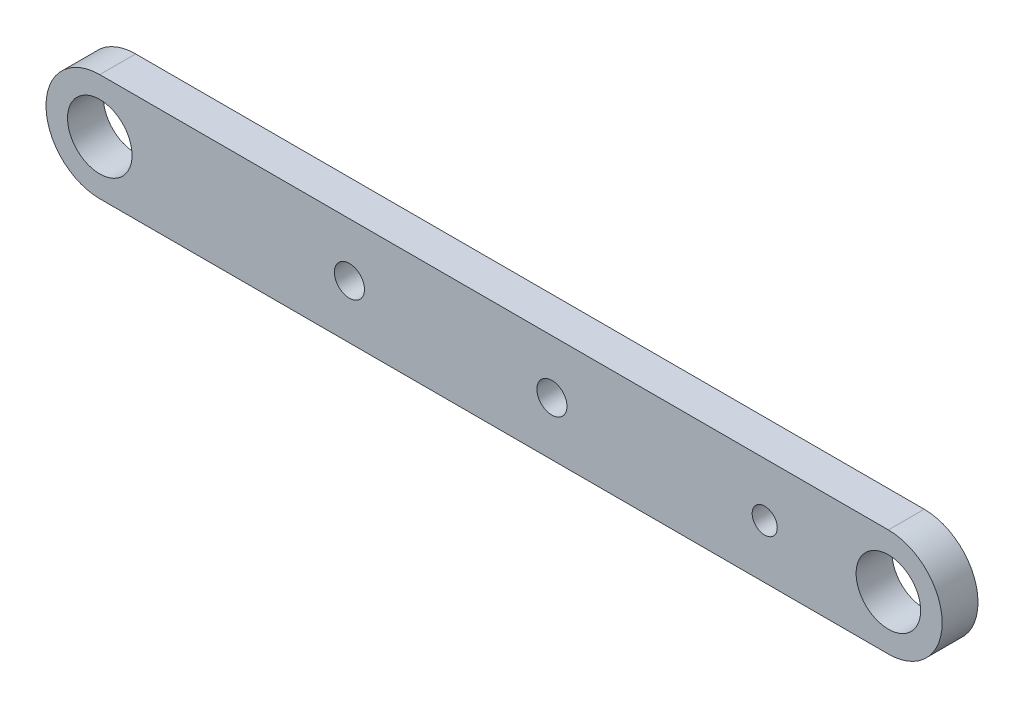
ISO-10303-21;
HEADER;
FILE_DESCRIPTION(('STEP AP214'),'2;1');
FILE_NAME('part.step','',(''),(''),'','','');
FILE_SCHEMA(('AUTOMOTIVE_DESIGN { 1 0 10303 214 1 1 1 1 }'));
ENDSEC;
DATA;
#1=APPLICATION_CONTEXT('core data for automotive mechanical design processes');
#2=APPLICATION_PROTOCOL_DEFINITION('international standard','automotive_design',2000,#1);
#3=PRODUCT_CONTEXT('',#1,'mechanical');
#4=PRODUCT('Part','Part','',(#3));
#5=PRODUCT_RELATED_PRODUCT_CATEGORY('part','',(#4));
#6=PRODUCT_DEFINITION_FORMATION('','',#4);
#7=PRODUCT_DEFINITION_CONTEXT('part definition',#1,'design');
#8=PRODUCT_DEFINITION('design','',#6,#7);
#9=PRODUCT_DEFINITION_SHAPE('','',#8);
#10=(LENGTH_UNIT() NAMED_UNIT(*) SI_UNIT(.MILLI.,.METRE.));
#11=(NAMED_UNIT(*) PLANE_ANGLE_UNIT() SI_UNIT($,.RADIAN.));
#12=(NAMED_UNIT(*) SI_UNIT($,.STERADIAN.) SOLID_ANGLE_UNIT());
#13=UNCERTAINTY_MEASURE_WITH_UNIT(LENGTH_MEASURE(1.E-05),#10,'distance_accuracy_value','');
#14=(GEOMETRIC_REPRESENTATION_CONTEXT(3) GLOBAL_UNCERTAINTY_ASSIGNED_CONTEXT((#13)) GLOBAL_UNIT_ASSIGNED_CONTEXT((#10,
#11,#12)) REPRESENTATION_CONTEXT('',''));
#15=CARTESIAN_POINT('',(0.,0.,0.));
#16=DIRECTION('',(0.,0.,1.));
#17=DIRECTION('',(1.,0.,0.));
#18=AXIS2_PLACEMENT_3D('',#15,#16,#17);
#19=CARTESIAN_POINT('',(-110.,0.,5.));
#20=DIRECTION('',(0.,0.,1.));
#21=DIRECTION('',(1.,0.,0.));
#22=AXIS2_PLACEMENT_3D('',#19,#20,#21);
#23=PLANE('',#22);
#24=CARTESIAN_POINT('',(-46.93,0.,5.));
#25=DIRECTION('',(0.,0.,1.));
#26=DIRECTION('',(1.,0.,0.));
#27=AXIS2_PLACEMENT_3D('',#24,#25,#26);
#28=CIRCLE('',#27,2.1);
#29=CARTESIAN_POINT('',(-44.83,0.,5.));
#30=VERTEX_POINT('',#29);
#31=EDGE_CURVE('E128',#30,#30,#28,.T.);
#32=ORIENTED_EDGE('',*,*,#31,.F.);
#33=EDGE_LOOP('',(#32));
#34=FACE_BOUND('',#33,.T.);
#35=CARTESIAN_POINT('',(-110.,0.,5.));
#36=DIRECTION('',(0.,0.,1.));
#37=DIRECTION('',(1.,0.,0.));
#38=AXIS2_PLACEMENT_3D('',#35,#36,#37);
#39=CIRCLE('',#38,4.5);
#40=CARTESIAN_POINT('',(-105.5,0.,5.));
#41=VERTEX_POINT('',#40);
#42=EDGE_CURVE('E116',#41,#41,#39,.T.);
#43=ORIENTED_EDGE('',*,*,#42,.F.);
#44=EDGE_LOOP('',(#43));
#45=FACE_BOUND('',#44,.T.);
#46=CARTESIAN_POINT('',(-110.,0.,5.));
#47=DIRECTION('',(0.,0.,1.));
#48=DIRECTION('',(1.,0.,0.));
#49=AXIS2_PLACEMENT_3D('',#46,#47,#48);
#50=CIRCLE('',#49,7.5);
#51=CARTESIAN_POINT('',(-110.,7.5,5.));
#52=VERTEX_POINT('',#51);
#53=CARTESIAN_POINT('',(-110.,-7.5,5.));
#54=VERTEX_POINT('',#53);
#55=EDGE_CURVE('E86',#52,#54,#50,.T.);
#56=ORIENTED_EDGE('',*,*,#55,.T.);
#57=DIRECTION('',(1.,0.,0.));
#58=VECTOR('',#57,1.);
#59=CARTESIAN_POINT('',(-110.,-7.5,5.));
#60=LINE('',#59,#58);
#61=CARTESIAN_POINT('',(0.,-7.5,5.));
#62=VERTEX_POINT('',#61);
#63=EDGE_CURVE('E81',#54,#62,#60,.T.);
#64=ORIENTED_EDGE('',*,*,#63,.T.);
#65=CARTESIAN_POINT('',(0.,0.,5.));
#66=DIRECTION('',(0.,0.,1.));
#67=DIRECTION('',(1.,0.,0.));
#68=AXIS2_PLACEMENT_3D('',#65,#66,#67);
#69=CIRCLE('',#68,7.5);
#70=CARTESIAN_POINT('',(0.,7.5,5.));
#71=VERTEX_POINT('',#70);
#72=EDGE_CURVE('E84',#62,#71,#69,.T.);
#73=ORIENTED_EDGE('',*,*,#72,.T.);
#74=DIRECTION('',(-1.,0.,0.));
#75=VECTOR('',#74,1.);
#76=CARTESIAN_POINT('',(-110.,7.5,5.));
#77=LINE('',#76,#75);
#78=EDGE_CURVE('E51',#71,#52,#77,.T.);
#79=ORIENTED_EDGE('',*,*,#78,.T.);
#80=EDGE_LOOP('',(#56,#64,#73,#79));
#81=FACE_BOUND('',#80,.T.);
#82=CARTESIAN_POINT('',(0.,0.,5.));
#83=DIRECTION('',(0.,0.,1.));
#84=DIRECTION('',(1.,0.,0.));
#85=AXIS2_PLACEMENT_3D('',#82,#83,#84);
#86=CIRCLE('',#85,4.5);
#87=CARTESIAN_POINT('',(4.5,0.,5.));
#88=VERTEX_POINT('',#87);
#89=EDGE_CURVE('E101',#88,#88,#86,.T.);
#90=ORIENTED_EDGE('',*,*,#89,.F.);
#91=EDGE_LOOP('',(#90));
#92=FACE_BOUND('',#91,.T.);
#93=CARTESIAN_POINT('',(-75.18,0.,5.));
#94=DIRECTION('',(0.,0.,1.));
#95=DIRECTION('',(1.,0.,0.));
#96=AXIS2_PLACEMENT_3D('',#93,#94,#95);
#97=CIRCLE('',#96,2.1);
#98=CARTESIAN_POINT('',(-73.08,0.,5.));
#99=VERTEX_POINT('',#98);
#100=EDGE_CURVE('E122',#99,#99,#97,.T.);
#101=ORIENTED_EDGE('',*,*,#100,.F.);
#102=EDGE_LOOP('',(#101));
#103=FACE_BOUND('',#102,.T.);
#104=CARTESIAN_POINT('',(-17.25,0.,5.));
#105=DIRECTION('',(0.,0.,1.));
#106=DIRECTION('',(1.,0.,0.));
#107=AXIS2_PLACEMENT_3D('',#104,#105,#106);
#108=CIRCLE('',#107,1.75);
#109=CARTESIAN_POINT('',(-15.5,0.,5.));
#110=VERTEX_POINT('',#109);
#111=EDGE_CURVE('E134',#110,#110,#108,.T.);
#112=ORIENTED_EDGE('',*,*,#111,.F.);
#113=EDGE_LOOP('',(#112));
#114=FACE_BOUND('',#113,.T.);
#115=ADVANCED_FACE('F34',(#34,#45,#81,#92,#103,#114),#23,.T.);
#116=CARTESIAN_POINT('',(-110.,0.,0.));
#117=DIRECTION('',(0.,0.,1.));
#118=DIRECTION('',(1.,0.,0.));
#119=AXIS2_PLACEMENT_3D('',#116,#117,#118);
#120=PLANE('',#119);
#121=CARTESIAN_POINT('',(-110.,0.,0.));
#122=DIRECTION('',(0.,0.,1.));
#123=DIRECTION('',(1.,0.,0.));
#124=AXIS2_PLACEMENT_3D('',#121,#122,#123);
#125=CIRCLE('',#124,7.5);
#126=CARTESIAN_POINT('',(-110.,7.5,0.));
#127=VERTEX_POINT('',#126);
#128=CARTESIAN_POINT('',(-110.,-7.5,0.));
#129=VERTEX_POINT('',#128);
#130=EDGE_CURVE('E98',#127,#129,#125,.T.);
#131=ORIENTED_EDGE('',*,*,#130,.F.);
#132=DIRECTION('',(-1.,0.,0.));
#133=VECTOR('',#132,1.);
#134=CARTESIAN_POINT('',(-110.,7.5,0.));
#135=LINE('',#134,#133);
#136=CARTESIAN_POINT('',(0.,7.5,0.));
#137=VERTEX_POINT('',#136);
#138=EDGE_CURVE('E74',#137,#127,#135,.T.);
#139=ORIENTED_EDGE('',*,*,#138,.F.);
#140=CARTESIAN_POINT('',(0.,0.,0.));
#141=DIRECTION('',(0.,0.,1.));
#142=DIRECTION('',(1.,0.,0.));
#143=AXIS2_PLACEMENT_3D('',#140,#141,#142);
#144=CIRCLE('',#143,7.5);
#145=CARTESIAN_POINT('',(0.,-7.5,0.));
#146=VERTEX_POINT('',#145);
#147=EDGE_CURVE('E68',#146,#137,#144,.T.);
#148=ORIENTED_EDGE('',*,*,#147,.F.);
#149=DIRECTION('',(1.,0.,0.));
#150=VECTOR('',#149,1.);
#151=CARTESIAN_POINT('',(-110.,-7.5,0.));
#152=LINE('',#151,#150);
#153=EDGE_CURVE('E90',#129,#146,#152,.T.);
#154=ORIENTED_EDGE('',*,*,#153,.F.);
#155=EDGE_LOOP('',(#131,#139,#148,#154));
#156=FACE_BOUND('',#155,.T.);
#157=CARTESIAN_POINT('',(0.,0.,0.));
#158=DIRECTION('',(0.,0.,1.));
#159=DIRECTION('',(1.,0.,0.));
#160=AXIS2_PLACEMENT_3D('',#157,#158,#159);
#161=CIRCLE('',#160,4.5);
#162=CARTESIAN_POINT('',(4.5,0.,0.));
#163=VERTEX_POINT('',#162);
#164=EDGE_CURVE('E113',#163,#163,#161,.T.);
#165=ORIENTED_EDGE('',*,*,#164,.T.);
#166=EDGE_LOOP('',(#165));
#167=FACE_BOUND('',#166,.T.);
#168=CARTESIAN_POINT('',(-110.,0.,0.));
#169=DIRECTION('',(0.,0.,1.));
#170=DIRECTION('',(1.,0.,0.));
#171=AXIS2_PLACEMENT_3D('',#168,#169,#170);
#172=CIRCLE('',#171,4.5);
#173=CARTESIAN_POINT('',(-105.5,0.,0.));
#174=VERTEX_POINT('',#173);
#175=EDGE_CURVE('E119',#174,#174,#172,.T.);
#176=ORIENTED_EDGE('',*,*,#175,.T.);
#177=EDGE_LOOP('',(#176));
#178=FACE_BOUND('',#177,.T.);
#179=CARTESIAN_POINT('',(-75.18,0.,0.));
#180=DIRECTION('',(0.,0.,1.));
#181=DIRECTION('',(1.,0.,0.));
#182=AXIS2_PLACEMENT_3D('',#179,#180,#181);
#183=CIRCLE('',#182,2.1);
#184=CARTESIAN_POINT('',(-73.08,0.,0.));
#185=VERTEX_POINT('',#184);
#186=EDGE_CURVE('E125',#185,#185,#183,.T.);
#187=ORIENTED_EDGE('',*,*,#186,.T.);
#188=EDGE_LOOP('',(#187));
#189=FACE_BOUND('',#188,.T.);
#190=CARTESIAN_POINT('',(-46.93,0.,0.));
#191=DIRECTION('',(0.,0.,1.));
#192=DIRECTION('',(1.,0.,0.));
#193=AXIS2_PLACEMENT_3D('',#190,#191,#192);
#194=CIRCLE('',#193,2.1);
#195=CARTESIAN_POINT('',(-44.83,0.,0.));
#196=VERTEX_POINT('',#195);
#197=EDGE_CURVE('E131',#196,#196,#194,.T.);
#198=ORIENTED_EDGE('',*,*,#197,.T.);
#199=EDGE_LOOP('',(#198));
#200=FACE_BOUND('',#199,.T.);
#201=CARTESIAN_POINT('',(-17.25,0.,0.));
#202=DIRECTION('',(0.,0.,1.));
#203=DIRECTION('',(1.,0.,0.));
#204=AXIS2_PLACEMENT_3D('',#201,#202,#203);
#205=CIRCLE('',#204,1.75);
#206=CARTESIAN_POINT('',(-15.5,0.,0.));
#207=VERTEX_POINT('',#206);
#208=EDGE_CURVE('E137',#207,#207,#205,.T.);
#209=ORIENTED_EDGE('',*,*,#208,.T.);
#210=EDGE_LOOP('',(#209));
#211=FACE_BOUND('',#210,.T.);
#212=ADVANCED_FACE('F109',(#156,#167,#178,#189,#200,#211),#120,.F.);
#213=CARTESIAN_POINT('',(-110.,0.,5.));
#214=DIRECTION('',(0.,0.,-1.));
#215=DIRECTION('',(-1.,0.,0.));
#216=AXIS2_PLACEMENT_3D('',#213,#214,#215);
#217=CYLINDRICAL_SURFACE('',#216,7.5);
#218=ORIENTED_EDGE('',*,*,#130,.T.);
#219=DIRECTION('',(0.,0.,-1.));
#220=VECTOR('',#219,1.);
#221=CARTESIAN_POINT('',(-110.,-7.5,5.));
#222=LINE('',#221,#220);
#223=EDGE_CURVE('E11',#54,#129,#222,.T.);
#224=ORIENTED_EDGE('',*,*,#223,.F.);
#225=ORIENTED_EDGE('',*,*,#55,.F.);
#226=DIRECTION('',(0.,0.,-1.));
#227=VECTOR('',#226,1.);
#228=CARTESIAN_POINT('',(-110.,7.5,5.));
#229=LINE('',#228,#227);
#230=EDGE_CURVE('E94',#52,#127,#229,.T.);
#231=ORIENTED_EDGE('',*,*,#230,.T.);
#232=EDGE_LOOP('',(#218,#224,#225,#231));
#233=FACE_BOUND('',#232,.T.);
#234=ADVANCED_FACE('F36',(#233),#217,.T.);
#235=CARTESIAN_POINT('',(-110.,-7.5,5.));
#236=DIRECTION('',(0.,1.,0.));
#237=DIRECTION('',(0.,0.,1.));
#238=AXIS2_PLACEMENT_3D('',#235,#236,#237);
#239=PLANE('',#238);
#240=ORIENTED_EDGE('',*,*,#153,.T.);
#241=DIRECTION('',(0.,0.,-1.));
#242=VECTOR('',#241,1.);
#243=CARTESIAN_POINT('',(0.,-7.5,5.));
#244=LINE('',#243,#242);
#245=EDGE_CURVE('E43',#62,#146,#244,.T.);
#246=ORIENTED_EDGE('',*,*,#245,.F.);
#247=ORIENTED_EDGE('',*,*,#63,.F.);
#248=ORIENTED_EDGE('',*,*,#223,.T.);
#249=EDGE_LOOP('',(#240,#246,#247,#248));
#250=FACE_BOUND('',#249,.T.);
#251=ADVANCED_FACE('F89',(#250),#239,.F.);
#252=CARTESIAN_POINT('',(0.,0.,5.));
#253=DIRECTION('',(0.,0.,-1.));
#254=DIRECTION('',(-1.,0.,0.));
#255=AXIS2_PLACEMENT_3D('',#252,#253,#254);
#256=CYLINDRICAL_SURFACE('',#255,7.5);
#257=ORIENTED_EDGE('',*,*,#147,.T.);
#258=DIRECTION('',(0.,0.,-1.));
#259=VECTOR('',#258,1.);
#260=CARTESIAN_POINT('',(0.,7.5,5.));
#261=LINE('',#260,#259);
#262=EDGE_CURVE('E91',#71,#137,#261,.T.);
#263=ORIENTED_EDGE('',*,*,#262,.F.);
#264=ORIENTED_EDGE('',*,*,#72,.F.);
#265=ORIENTED_EDGE('',*,*,#245,.T.);
#266=EDGE_LOOP('',(#257,#263,#264,#265));
#267=FACE_BOUND('',#266,.T.);
#268=ADVANCED_FACE('F92',(#267),#256,.T.);
#269=CARTESIAN_POINT('',(-110.,7.5,5.));
#270=DIRECTION('',(0.,-1.,0.));
#271=DIRECTION('',(0.,0.,-1.));
#272=AXIS2_PLACEMENT_3D('',#269,#270,#271);
#273=PLANE('',#272);
#274=ORIENTED_EDGE('',*,*,#138,.T.);
#275=ORIENTED_EDGE('',*,*,#230,.F.);
#276=ORIENTED_EDGE('',*,*,#78,.F.);
#277=ORIENTED_EDGE('',*,*,#262,.T.);
#278=EDGE_LOOP('',(#274,#275,#276,#277));
#279=FACE_BOUND('',#278,.T.);
#280=ADVANCED_FACE('F106',(#279),#273,.F.);
#281=CARTESIAN_POINT('',(0.,0.,5.));
#282=DIRECTION('',(0.,0.,-1.));
#283=DIRECTION('',(-1.,0.,0.));
#284=AXIS2_PLACEMENT_3D('',#281,#282,#283);
#285=CYLINDRICAL_SURFACE('',#284,4.5);
#286=ORIENTED_EDGE('',*,*,#89,.T.);
#287=EDGE_LOOP('',(#286));
#288=FACE_BOUND('',#287,.T.);
#289=ORIENTED_EDGE('',*,*,#164,.F.);
#290=EDGE_LOOP('',(#289));
#291=FACE_BOUND('',#290,.T.);
#292=ADVANCED_FACE('F156',(#288,#291),#285,.F.);
#293=CARTESIAN_POINT('',(-110.,0.,5.));
#294=DIRECTION('',(0.,0.,-1.));
#295=DIRECTION('',(-1.,0.,0.));
#296=AXIS2_PLACEMENT_3D('',#293,#294,#295);
#297=CYLINDRICAL_SURFACE('',#296,4.5);
#298=ORIENTED_EDGE('',*,*,#42,.T.);
#299=EDGE_LOOP('',(#298));
#300=FACE_BOUND('',#299,.T.);
#301=ORIENTED_EDGE('',*,*,#175,.F.);
#302=EDGE_LOOP('',(#301));
#303=FACE_BOUND('',#302,.T.);
#304=ADVANCED_FACE('F202',(#300,#303),#297,.F.);
#305=CARTESIAN_POINT('',(-75.18,0.,5.));
#306=DIRECTION('',(0.,0.,-1.));
#307=DIRECTION('',(-1.,0.,0.));
#308=AXIS2_PLACEMENT_3D('',#305,#306,#307);
#309=CYLINDRICAL_SURFACE('',#308,2.1);
#310=ORIENTED_EDGE('',*,*,#100,.T.);
#311=EDGE_LOOP('',(#310));
#312=FACE_BOUND('',#311,.T.);
#313=ORIENTED_EDGE('',*,*,#186,.F.);
#314=EDGE_LOOP('',(#313));
#315=FACE_BOUND('',#314,.T.);
#316=ADVANCED_FACE('F210',(#312,#315),#309,.F.);
#317=CARTESIAN_POINT('',(-46.93,0.,5.));
#318=DIRECTION('',(0.,0.,-1.));
#319=DIRECTION('',(-1.,0.,0.));
#320=AXIS2_PLACEMENT_3D('',#317,#318,#319);
#321=CYLINDRICAL_SURFACE('',#320,2.1);
#322=ORIENTED_EDGE('',*,*,#31,.T.);
#323=EDGE_LOOP('',(#322));
#324=FACE_BOUND('',#323,.T.);
#325=ORIENTED_EDGE('',*,*,#197,.F.);
#326=EDGE_LOOP('',(#325));
#327=FACE_BOUND('',#326,.T.);
#328=ADVANCED_FACE('F218',(#324,#327),#321,.F.);
#329=CARTESIAN_POINT('',(-17.25,0.,5.));
#330=DIRECTION('',(0.,0.,-1.));
#331=DIRECTION('',(-1.,0.,0.));
#332=AXIS2_PLACEMENT_3D('',#329,#330,#331);
#333=CYLINDRICAL_SURFACE('',#332,1.75);
#334=ORIENTED_EDGE('',*,*,#111,.T.);
#335=EDGE_LOOP('',(#334));
#336=FACE_BOUND('',#335,.T.);
#337=ORIENTED_EDGE('',*,*,#208,.F.);
#338=EDGE_LOOP('',(#337));
#339=FACE_BOUND('',#338,.T.);
#340=ADVANCED_FACE('F143',(#336,#339),#333,.F.);
#341=CLOSED_SHELL('',(#115,#212,#234,#251,#268,#280,#292,#304,#316,#328,#340));
#342=MANIFOLD_SOLID_BREP('B2',#341);
#343=ADVANCED_BREP_SHAPE_REPRESENTATION('',(#18,#342),#14);
#344=SHAPE_DEFINITION_REPRESENTATION(#9,#343);
ENDSEC;
END-ISO-10303-21;
